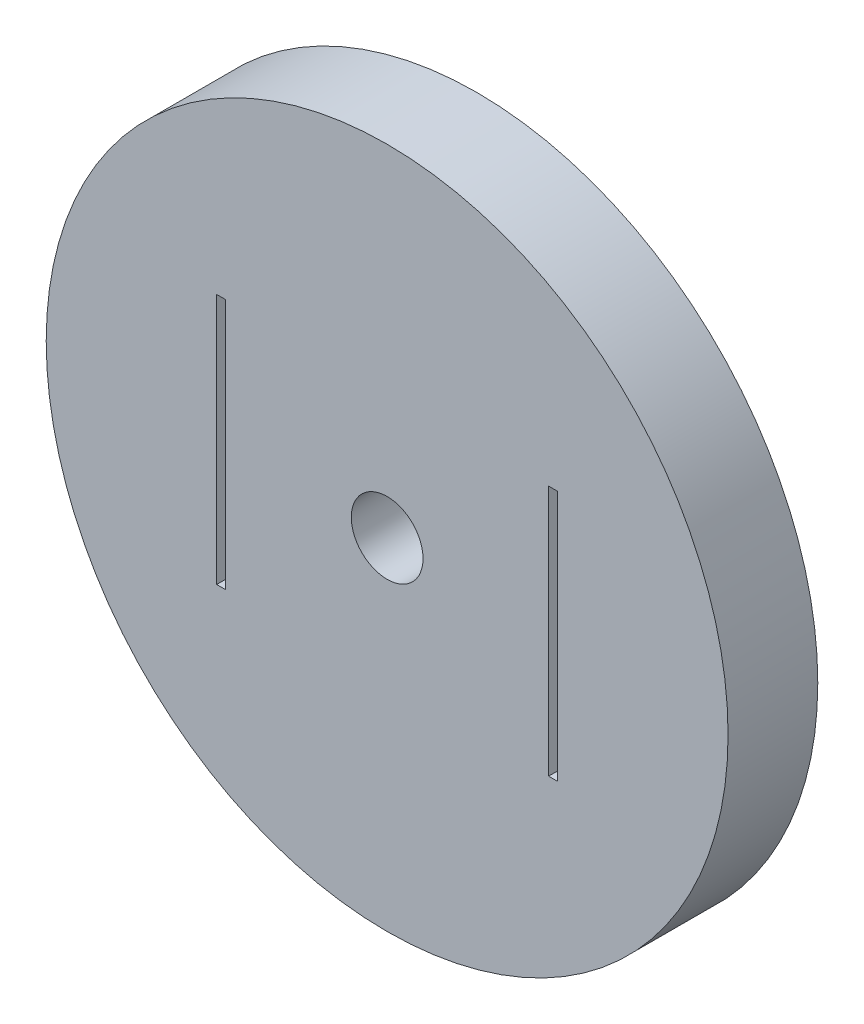
ISO-10303-21;
HEADER;
FILE_DESCRIPTION(('STEP AP214'),'2;1');
FILE_NAME('part.step','',(''),(''),'','','');
FILE_SCHEMA(('AUTOMOTIVE_DESIGN { 1 0 10303 214 1 1 1 1 }'));
ENDSEC;
DATA;
#1=APPLICATION_CONTEXT('core data for automotive mechanical design processes');
#2=APPLICATION_PROTOCOL_DEFINITION('international standard','automotive_design',2000,#1);
#3=PRODUCT_CONTEXT('',#1,'mechanical');
#4=PRODUCT('Part','Part','',(#3));
#5=PRODUCT_RELATED_PRODUCT_CATEGORY('part','',(#4));
#6=PRODUCT_DEFINITION_FORMATION('','',#4);
#7=PRODUCT_DEFINITION_CONTEXT('part definition',#1,'design');
#8=PRODUCT_DEFINITION('design','',#6,#7);
#9=PRODUCT_DEFINITION_SHAPE('','',#8);
#10=(LENGTH_UNIT() NAMED_UNIT(*) SI_UNIT(.MILLI.,.METRE.));
#11=(NAMED_UNIT(*) PLANE_ANGLE_UNIT() SI_UNIT($,.RADIAN.));
#12=(NAMED_UNIT(*) SI_UNIT($,.STERADIAN.) SOLID_ANGLE_UNIT());
#13=UNCERTAINTY_MEASURE_WITH_UNIT(LENGTH_MEASURE(1.E-05),#10,'distance_accuracy_value','');
#14=(GEOMETRIC_REPRESENTATION_CONTEXT(3) GLOBAL_UNCERTAINTY_ASSIGNED_CONTEXT((#13)) GLOBAL_UNIT_ASSIGNED_CONTEXT((#10,
#11,#12)) REPRESENTATION_CONTEXT('',''));
#15=CARTESIAN_POINT('',(0.,0.,0.));
#16=DIRECTION('',(0.,0.,1.));
#17=DIRECTION('',(1.,0.,0.));
#18=AXIS2_PLACEMENT_3D('',#15,#16,#17);
#19=CARTESIAN_POINT('',(0.,0.,5.));
#20=DIRECTION('',(0.,0.,1.));
#21=DIRECTION('',(1.,0.,0.));
#22=AXIS2_PLACEMENT_3D('',#19,#20,#21);
#23=PLANE('',#22);
#24=CARTESIAN_POINT('',(0.,0.,5.));
#25=DIRECTION('',(0.,0.,1.));
#26=DIRECTION('',(1.,0.,0.));
#27=AXIS2_PLACEMENT_3D('',#24,#25,#26);
#28=CIRCLE('',#27,19.);
#29=CARTESIAN_POINT('',(19.,0.,5.));
#30=VERTEX_POINT('',#29);
#31=EDGE_CURVE('E42',#30,#30,#28,.T.);
#32=ORIENTED_EDGE('',*,*,#31,.T.);
#33=EDGE_LOOP('',(#32));
#34=FACE_BOUND('',#33,.T.);
#35=CARTESIAN_POINT('',(0.,0.,5.));
#36=DIRECTION('',(0.,0.,1.));
#37=DIRECTION('',(1.,0.,0.));
#38=AXIS2_PLACEMENT_3D('',#35,#36,#37);
#39=CIRCLE('',#38,2.);
#40=CARTESIAN_POINT('',(2.,0.,5.));
#41=VERTEX_POINT('',#40);
#42=EDGE_CURVE('E168',#41,#41,#39,.T.);
#43=ORIENTED_EDGE('',*,*,#42,.F.);
#44=EDGE_LOOP('',(#43));
#45=FACE_BOUND('',#44,.T.);
#46=DIRECTION('',(1.,0.,0.));
#47=VECTOR('',#46,1.);
#48=CARTESIAN_POINT('',(-9.5,-7.,5.));
#49=LINE('',#48,#47);
#50=CARTESIAN_POINT('',(-9.5,-7.,5.));
#51=VERTEX_POINT('',#50);
#52=CARTESIAN_POINT('',(-9.,-7.,5.));
#53=VERTEX_POINT('',#52);
#54=EDGE_CURVE('E139',#51,#53,#49,.T.);
#55=ORIENTED_EDGE('',*,*,#54,.F.);
#56=DIRECTION('',(0.,-1.,0.));
#57=VECTOR('',#56,1.);
#58=CARTESIAN_POINT('',(-9.5,7.,5.));
#59=LINE('',#58,#57);
#60=CARTESIAN_POINT('',(-9.5,7.,5.));
#61=VERTEX_POINT('',#60);
#62=EDGE_CURVE('E137',#61,#51,#59,.T.);
#63=ORIENTED_EDGE('',*,*,#62,.F.);
#64=DIRECTION('',(-1.,0.,0.));
#65=VECTOR('',#64,1.);
#66=CARTESIAN_POINT('',(-9.5,7.,5.));
#67=LINE('',#66,#65);
#68=CARTESIAN_POINT('',(-9.,7.,5.));
#69=VERTEX_POINT('',#68);
#70=EDGE_CURVE('E145',#69,#61,#67,.T.);
#71=ORIENTED_EDGE('',*,*,#70,.F.);
#72=DIRECTION('',(0.,1.,0.));
#73=VECTOR('',#72,1.);
#74=CARTESIAN_POINT('',(-9.,7.,5.));
#75=LINE('',#74,#73);
#76=EDGE_CURVE('E142',#53,#69,#75,.T.);
#77=ORIENTED_EDGE('',*,*,#76,.F.);
#78=EDGE_LOOP('',(#55,#63,#71,#77));
#79=FACE_BOUND('',#78,.T.);
#80=DIRECTION('',(0.,-1.,0.));
#81=VECTOR('',#80,1.);
#82=CARTESIAN_POINT('',(9.,7.,5.));
#83=LINE('',#82,#81);
#84=CARTESIAN_POINT('',(9.,7.,5.));
#85=VERTEX_POINT('',#84);
#86=CARTESIAN_POINT('',(9.,-7.,5.));
#87=VERTEX_POINT('',#86);
#88=EDGE_CURVE('E108',#85,#87,#83,.T.);
#89=ORIENTED_EDGE('',*,*,#88,.F.);
#90=DIRECTION('',(-1.,0.,0.));
#91=VECTOR('',#90,1.);
#92=CARTESIAN_POINT('',(9.5,7.,5.));
#93=LINE('',#92,#91);
#94=CARTESIAN_POINT('',(9.5,7.,5.));
#95=VERTEX_POINT('',#94);
#96=EDGE_CURVE('E100',#95,#85,#93,.T.);
#97=ORIENTED_EDGE('',*,*,#96,.F.);
#98=DIRECTION('',(0.,1.,0.));
#99=VECTOR('',#98,1.);
#100=CARTESIAN_POINT('',(9.5,7.,5.));
#101=LINE('',#100,#99);
#102=CARTESIAN_POINT('',(9.5,-7.,5.));
#103=VERTEX_POINT('',#102);
#104=EDGE_CURVE('E122',#103,#95,#101,.T.);
#105=ORIENTED_EDGE('',*,*,#104,.F.);
#106=DIRECTION('',(1.,0.,0.));
#107=VECTOR('',#106,1.);
#108=CARTESIAN_POINT('',(9.5,-7.,5.));
#109=LINE('',#108,#107);
#110=EDGE_CURVE('E120',#87,#103,#109,.T.);
#111=ORIENTED_EDGE('',*,*,#110,.F.);
#112=EDGE_LOOP('',(#89,#97,#105,#111));
#113=FACE_BOUND('',#112,.T.);
#114=ADVANCED_FACE('F33',(#34,#45,#79,#113),#23,.T.);
#115=CARTESIAN_POINT('',(0.,0.,0.));
#116=DIRECTION('',(0.,0.,1.));
#117=DIRECTION('',(1.,0.,0.));
#118=AXIS2_PLACEMENT_3D('',#115,#116,#117);
#119=PLANE('',#118);
#120=CARTESIAN_POINT('',(-14.5,0.,0.));
#121=DIRECTION('',(0.,0.,-1.));
#122=DIRECTION('',(-1.,0.,0.));
#123=AXIS2_PLACEMENT_3D('',#120,#121,#122);
#124=CIRCLE('',#123,2.);
#125=CARTESIAN_POINT('',(-16.5,0.,0.));
#126=VERTEX_POINT('',#125);
#127=EDGE_CURVE('E11',#126,#126,#124,.T.);
#128=ORIENTED_EDGE('',*,*,#127,.F.);
#129=EDGE_LOOP('',(#128));
#130=FACE_BOUND('',#129,.T.);
#131=DIRECTION('',(0.,-1.,0.));
#132=VECTOR('',#131,1.);
#133=CARTESIAN_POINT('',(-9.5,7.,0.));
#134=LINE('',#133,#132);
#135=CARTESIAN_POINT('',(-9.5,7.,0.));
#136=VERTEX_POINT('',#135);
#137=CARTESIAN_POINT('',(-9.5,-7.,0.));
#138=VERTEX_POINT('',#137);
#139=EDGE_CURVE('E116',#136,#138,#134,.T.);
#140=ORIENTED_EDGE('',*,*,#139,.T.);
#141=DIRECTION('',(1.,0.,0.));
#142=VECTOR('',#141,1.);
#143=CARTESIAN_POINT('',(-9.5,-7.,0.));
#144=LINE('',#143,#142);
#145=CARTESIAN_POINT('',(-9.,-7.,0.));
#146=VERTEX_POINT('',#145);
#147=EDGE_CURVE('E150',#138,#146,#144,.T.);
#148=ORIENTED_EDGE('',*,*,#147,.T.);
#149=DIRECTION('',(0.,1.,0.));
#150=VECTOR('',#149,1.);
#151=CARTESIAN_POINT('',(-9.,7.,0.));
#152=LINE('',#151,#150);
#153=CARTESIAN_POINT('',(-9.,7.,0.));
#154=VERTEX_POINT('',#153);
#155=EDGE_CURVE('E153',#146,#154,#152,.T.);
#156=ORIENTED_EDGE('',*,*,#155,.T.);
#157=DIRECTION('',(-1.,0.,0.));
#158=VECTOR('',#157,1.);
#159=CARTESIAN_POINT('',(-9.5,7.,0.));
#160=LINE('',#159,#158);
#161=EDGE_CURVE('E140',#154,#136,#160,.T.);
#162=ORIENTED_EDGE('',*,*,#161,.T.);
#163=EDGE_LOOP('',(#140,#148,#156,#162));
#164=FACE_BOUND('',#163,.T.);
#165=CARTESIAN_POINT('',(0.,0.,0.));
#166=DIRECTION('',(0.,0.,1.));
#167=DIRECTION('',(1.,0.,0.));
#168=AXIS2_PLACEMENT_3D('',#165,#166,#167);
#169=CIRCLE('',#168,19.);
#170=CARTESIAN_POINT('',(19.,0.,0.));
#171=VERTEX_POINT('',#170);
#172=EDGE_CURVE('E37',#171,#171,#169,.T.);
#173=ORIENTED_EDGE('',*,*,#172,.F.);
#174=EDGE_LOOP('',(#173));
#175=FACE_BOUND('',#174,.T.);
#176=CARTESIAN_POINT('',(0.,0.,0.));
#177=DIRECTION('',(0.,0.,1.));
#178=DIRECTION('',(1.,0.,0.));
#179=AXIS2_PLACEMENT_3D('',#176,#177,#178);
#180=CIRCLE('',#179,2.);
#181=CARTESIAN_POINT('',(2.,0.,0.));
#182=VERTEX_POINT('',#181);
#183=EDGE_CURVE('E167',#182,#182,#180,.T.);
#184=ORIENTED_EDGE('',*,*,#183,.T.);
#185=EDGE_LOOP('',(#184));
#186=FACE_BOUND('',#185,.T.);
#187=DIRECTION('',(-1.,0.,0.));
#188=VECTOR('',#187,1.);
#189=CARTESIAN_POINT('',(9.5,7.,0.));
#190=LINE('',#189,#188);
#191=CARTESIAN_POINT('',(9.5,7.,0.));
#192=VERTEX_POINT('',#191);
#193=CARTESIAN_POINT('',(9.,7.,0.));
#194=VERTEX_POINT('',#193);
#195=EDGE_CURVE('E58',#192,#194,#190,.T.);
#196=ORIENTED_EDGE('',*,*,#195,.T.);
#197=DIRECTION('',(0.,-1.,0.));
#198=VECTOR('',#197,1.);
#199=CARTESIAN_POINT('',(9.,7.,0.));
#200=LINE('',#199,#198);
#201=CARTESIAN_POINT('',(9.,-7.,0.));
#202=VERTEX_POINT('',#201);
#203=EDGE_CURVE('E115',#194,#202,#200,.T.);
#204=ORIENTED_EDGE('',*,*,#203,.T.);
#205=DIRECTION('',(1.,0.,0.));
#206=VECTOR('',#205,1.);
#207=CARTESIAN_POINT('',(9.5,-7.,0.));
#208=LINE('',#207,#206);
#209=CARTESIAN_POINT('',(9.5,-7.,0.));
#210=VERTEX_POINT('',#209);
#211=EDGE_CURVE('E129',#202,#210,#208,.T.);
#212=ORIENTED_EDGE('',*,*,#211,.T.);
#213=DIRECTION('',(0.,1.,0.));
#214=VECTOR('',#213,1.);
#215=CARTESIAN_POINT('',(9.5,7.,0.));
#216=LINE('',#215,#214);
#217=EDGE_CURVE('E109',#210,#192,#216,.T.);
#218=ORIENTED_EDGE('',*,*,#217,.T.);
#219=EDGE_LOOP('',(#196,#204,#212,#218));
#220=FACE_BOUND('',#219,.T.);
#221=ADVANCED_FACE('F179',(#130,#164,#175,#186,#220),#119,.F.);
#222=CARTESIAN_POINT('',(0.,0.,5.));
#223=DIRECTION('',(0.,0.,-1.));
#224=DIRECTION('',(-1.,0.,0.));
#225=AXIS2_PLACEMENT_3D('',#222,#223,#224);
#226=CYLINDRICAL_SURFACE('',#225,19.);
#227=ORIENTED_EDGE('',*,*,#31,.F.);
#228=EDGE_LOOP('',(#227));
#229=FACE_BOUND('',#228,.T.);
#230=ORIENTED_EDGE('',*,*,#172,.T.);
#231=EDGE_LOOP('',(#230));
#232=FACE_BOUND('',#231,.T.);
#233=ADVANCED_FACE('F35',(#229,#232),#226,.T.);
#234=CARTESIAN_POINT('',(0.,0.,5.));
#235=DIRECTION('',(0.,0.,-1.));
#236=DIRECTION('',(-1.,0.,0.));
#237=AXIS2_PLACEMENT_3D('',#234,#235,#236);
#238=CYLINDRICAL_SURFACE('',#237,2.);
#239=ORIENTED_EDGE('',*,*,#42,.T.);
#240=EDGE_LOOP('',(#239));
#241=FACE_BOUND('',#240,.T.);
#242=ORIENTED_EDGE('',*,*,#183,.F.);
#243=EDGE_LOOP('',(#242));
#244=FACE_BOUND('',#243,.T.);
#245=ADVANCED_FACE('F206',(#241,#244),#238,.F.);
#246=CARTESIAN_POINT('',(-9.5,7.,5.));
#247=DIRECTION('',(1.,0.,0.));
#248=DIRECTION('',(0.,1.,0.));
#249=AXIS2_PLACEMENT_3D('',#246,#247,#248);
#250=PLANE('',#249);
#251=ORIENTED_EDGE('',*,*,#139,.F.);
#252=DIRECTION('',(0.,0.,-1.));
#253=VECTOR('',#252,1.);
#254=CARTESIAN_POINT('',(-9.5,7.,5.));
#255=LINE('',#254,#253);
#256=EDGE_CURVE('E147',#61,#136,#255,.T.);
#257=ORIENTED_EDGE('',*,*,#256,.F.);
#258=ORIENTED_EDGE('',*,*,#62,.T.);
#259=DIRECTION('',(0.,0.,-1.));
#260=VECTOR('',#259,1.);
#261=CARTESIAN_POINT('',(-9.5,-7.,5.));
#262=LINE('',#261,#260);
#263=EDGE_CURVE('E164',#51,#138,#262,.T.);
#264=ORIENTED_EDGE('',*,*,#263,.T.);
#265=EDGE_LOOP('',(#251,#257,#258,#264));
#266=FACE_BOUND('',#265,.T.);
#267=ADVANCED_FACE('F209',(#266),#250,.T.);
#268=CARTESIAN_POINT('',(-9.5,-7.,5.));
#269=DIRECTION('',(0.,1.,0.));
#270=DIRECTION('',(-1.,0.,0.));
#271=AXIS2_PLACEMENT_3D('',#268,#269,#270);
#272=PLANE('',#271);
#273=ORIENTED_EDGE('',*,*,#147,.F.);
#274=ORIENTED_EDGE('',*,*,#263,.F.);
#275=ORIENTED_EDGE('',*,*,#54,.T.);
#276=DIRECTION('',(0.,0.,-1.));
#277=VECTOR('',#276,1.);
#278=CARTESIAN_POINT('',(-9.,-7.,5.));
#279=LINE('',#278,#277);
#280=EDGE_CURVE('E162',#53,#146,#279,.T.);
#281=ORIENTED_EDGE('',*,*,#280,.T.);
#282=EDGE_LOOP('',(#273,#274,#275,#281));
#283=FACE_BOUND('',#282,.T.);
#284=ADVANCED_FACE('F213',(#283),#272,.T.);
#285=CARTESIAN_POINT('',(-9.,7.,5.));
#286=DIRECTION('',(-1.,0.,0.));
#287=DIRECTION('',(0.,-1.,0.));
#288=AXIS2_PLACEMENT_3D('',#285,#286,#287);
#289=PLANE('',#288);
#290=ORIENTED_EDGE('',*,*,#155,.F.);
#291=ORIENTED_EDGE('',*,*,#280,.F.);
#292=ORIENTED_EDGE('',*,*,#76,.T.);
#293=DIRECTION('',(0.,0.,-1.));
#294=VECTOR('',#293,1.);
#295=CARTESIAN_POINT('',(-9.,7.,5.));
#296=LINE('',#295,#294);
#297=EDGE_CURVE('E160',#69,#154,#296,.T.);
#298=ORIENTED_EDGE('',*,*,#297,.T.);
#299=EDGE_LOOP('',(#290,#291,#292,#298));
#300=FACE_BOUND('',#299,.T.);
#301=ADVANCED_FACE('F217',(#300),#289,.T.);
#302=CARTESIAN_POINT('',(-9.5,7.,5.));
#303=DIRECTION('',(0.,-1.,0.));
#304=DIRECTION('',(0.,0.,-1.));
#305=AXIS2_PLACEMENT_3D('',#302,#303,#304);
#306=PLANE('',#305);
#307=ORIENTED_EDGE('',*,*,#161,.F.);
#308=ORIENTED_EDGE('',*,*,#297,.F.);
#309=ORIENTED_EDGE('',*,*,#70,.T.);
#310=ORIENTED_EDGE('',*,*,#256,.T.);
#311=EDGE_LOOP('',(#307,#308,#309,#310));
#312=FACE_BOUND('',#311,.T.);
#313=ADVANCED_FACE('F221',(#312),#306,.T.);
#314=CARTESIAN_POINT('',(9.5,7.,5.));
#315=DIRECTION('',(0.,-1.,0.));
#316=DIRECTION('',(0.,0.,-1.));
#317=AXIS2_PLACEMENT_3D('',#314,#315,#316);
#318=PLANE('',#317);
#319=ORIENTED_EDGE('',*,*,#195,.F.);
#320=DIRECTION('',(0.,0.,-1.));
#321=VECTOR('',#320,1.);
#322=CARTESIAN_POINT('',(9.5,7.,5.));
#323=LINE('',#322,#321);
#324=EDGE_CURVE('E104',#95,#192,#323,.T.);
#325=ORIENTED_EDGE('',*,*,#324,.F.);
#326=ORIENTED_EDGE('',*,*,#96,.T.);
#327=DIRECTION('',(0.,0.,-1.));
#328=VECTOR('',#327,1.);
#329=CARTESIAN_POINT('',(9.,7.,5.));
#330=LINE('',#329,#328);
#331=EDGE_CURVE('E103',#85,#194,#330,.T.);
#332=ORIENTED_EDGE('',*,*,#331,.T.);
#333=EDGE_LOOP('',(#319,#325,#326,#332));
#334=FACE_BOUND('',#333,.T.);
#335=ADVANCED_FACE('F102',(#334),#318,.T.);
#336=CARTESIAN_POINT('',(9.,7.,5.));
#337=DIRECTION('',(1.,0.,0.));
#338=DIRECTION('',(0.,1.,0.));
#339=AXIS2_PLACEMENT_3D('',#336,#337,#338);
#340=PLANE('',#339);
#341=ORIENTED_EDGE('',*,*,#203,.F.);
#342=ORIENTED_EDGE('',*,*,#331,.F.);
#343=ORIENTED_EDGE('',*,*,#88,.T.);
#344=DIRECTION('',(0.,0.,-1.));
#345=VECTOR('',#344,1.);
#346=CARTESIAN_POINT('',(9.,-7.,5.));
#347=LINE('',#346,#345);
#348=EDGE_CURVE('E117',#87,#202,#347,.T.);
#349=ORIENTED_EDGE('',*,*,#348,.T.);
#350=EDGE_LOOP('',(#341,#342,#343,#349));
#351=FACE_BOUND('',#350,.T.);
#352=ADVANCED_FACE('F112',(#351),#340,.T.);
#353=CARTESIAN_POINT('',(9.5,-7.,5.));
#354=DIRECTION('',(0.,1.,0.));
#355=DIRECTION('',(-1.,0.,0.));
#356=AXIS2_PLACEMENT_3D('',#353,#354,#355);
#357=PLANE('',#356);
#358=ORIENTED_EDGE('',*,*,#211,.F.);
#359=ORIENTED_EDGE('',*,*,#348,.F.);
#360=ORIENTED_EDGE('',*,*,#110,.T.);
#361=DIRECTION('',(0.,0.,-1.));
#362=VECTOR('',#361,1.);
#363=CARTESIAN_POINT('',(9.5,-7.,5.));
#364=LINE('',#363,#362);
#365=EDGE_CURVE('E50',#103,#210,#364,.T.);
#366=ORIENTED_EDGE('',*,*,#365,.T.);
#367=EDGE_LOOP('',(#358,#359,#360,#366));
#368=FACE_BOUND('',#367,.T.);
#369=ADVANCED_FACE('F189',(#368),#357,.T.);
#370=CARTESIAN_POINT('',(9.5,7.,5.));
#371=DIRECTION('',(-1.,0.,0.));
#372=DIRECTION('',(0.,-1.,0.));
#373=AXIS2_PLACEMENT_3D('',#370,#371,#372);
#374=PLANE('',#373);
#375=ORIENTED_EDGE('',*,*,#217,.F.);
#376=ORIENTED_EDGE('',*,*,#365,.F.);
#377=ORIENTED_EDGE('',*,*,#104,.T.);
#378=ORIENTED_EDGE('',*,*,#324,.T.);
#379=EDGE_LOOP('',(#375,#376,#377,#378));
#380=FACE_BOUND('',#379,.T.);
#381=ADVANCED_FACE('F186',(#380),#374,.T.);
#382=CARTESIAN_POINT('',(-14.5,0.,-6.5));
#383=DIRECTION('',(0.,0.,-1.));
#384=DIRECTION('',(-1.,0.,0.));
#385=AXIS2_PLACEMENT_3D('',#382,#383,#384);
#386=CYLINDRICAL_SURFACE('',#385,2.);
#387=ORIENTED_EDGE('',*,*,#127,.T.);
#388=EDGE_LOOP('',(#387));
#389=FACE_BOUND('',#388,.T.);
#390=CARTESIAN_POINT('',(-14.5,0.,-6.5));
#391=DIRECTION('',(0.,0.,-1.));
#392=DIRECTION('',(-1.,0.,0.));
#393=AXIS2_PLACEMENT_3D('',#390,#391,#392);
#394=CIRCLE('',#393,2.);
#395=CARTESIAN_POINT('',(-16.5,0.,-6.5));
#396=VERTEX_POINT('',#395);
#397=EDGE_CURVE('E127',#396,#396,#394,.T.);
#398=ORIENTED_EDGE('',*,*,#397,.F.);
#399=EDGE_LOOP('',(#398));
#400=FACE_BOUND('',#399,.T.);
#401=ADVANCED_FACE('F188',(#389,#400),#386,.T.);
#402=CARTESIAN_POINT('',(-14.5,0.,-6.5));
#403=DIRECTION('',(0.,0.,-1.));
#404=DIRECTION('',(-1.,0.,0.));
#405=AXIS2_PLACEMENT_3D('',#402,#403,#404);
#406=SPHERICAL_SURFACE('',#405,2.);
#407=ORIENTED_EDGE('',*,*,#397,.T.);
#408=EDGE_LOOP('',(#407));
#409=FACE_BOUND('',#408,.T.);
#410=ADVANCED_FACE('F195',(#409),#406,.T.);
#411=CLOSED_SHELL('',(#114,#221,#233,#245,#267,#284,#301,#313,#335,#352,#369,#381,#401,#410));
#412=MANIFOLD_SOLID_BREP('B2',#411);
#413=ADVANCED_BREP_SHAPE_REPRESENTATION('',(#18,#412),#14);
#414=SHAPE_DEFINITION_REPRESENTATION(#9,#413);
ENDSEC;
END-ISO-10303-21;
